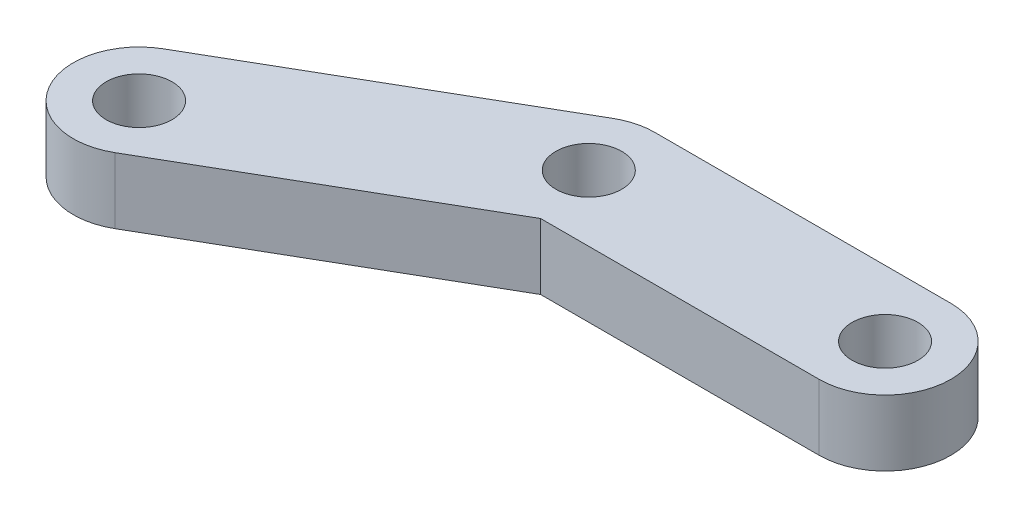
ISO-10303-21;
HEADER;
FILE_DESCRIPTION(('STEP AP214'),'2;1');
FILE_NAME('part.step','',(''),(''),'','','');
FILE_SCHEMA(('AUTOMOTIVE_DESIGN { 1 0 10303 214 1 1 1 1 }'));
ENDSEC;
DATA;
#1=APPLICATION_CONTEXT('core data for automotive mechanical design processes');
#2=APPLICATION_PROTOCOL_DEFINITION('international standard','automotive_design',2000,#1);
#3=PRODUCT_CONTEXT('',#1,'mechanical');
#4=PRODUCT('Part','Part','',(#3));
#5=PRODUCT_RELATED_PRODUCT_CATEGORY('part','',(#4));
#6=PRODUCT_DEFINITION_FORMATION('','',#4);
#7=PRODUCT_DEFINITION_CONTEXT('part definition',#1,'design');
#8=PRODUCT_DEFINITION('design','',#6,#7);
#9=PRODUCT_DEFINITION_SHAPE('','',#8);
#10=(LENGTH_UNIT() NAMED_UNIT(*) SI_UNIT(.MILLI.,.METRE.));
#11=(NAMED_UNIT(*) PLANE_ANGLE_UNIT() SI_UNIT($,.RADIAN.));
#12=(NAMED_UNIT(*) SI_UNIT($,.STERADIAN.) SOLID_ANGLE_UNIT());
#13=UNCERTAINTY_MEASURE_WITH_UNIT(LENGTH_MEASURE(1.E-05),#10,'distance_accuracy_value','');
#14=(GEOMETRIC_REPRESENTATION_CONTEXT(3) GLOBAL_UNCERTAINTY_ASSIGNED_CONTEXT((#13)) GLOBAL_UNIT_ASSIGNED_CONTEXT((#10,
#11,#12)) REPRESENTATION_CONTEXT('',''));
#15=CARTESIAN_POINT('',(0.,0.,0.));
#16=DIRECTION('',(0.,0.,1.));
#17=DIRECTION('',(1.,0.,0.));
#18=AXIS2_PLACEMENT_3D('',#15,#16,#17);
#19=CARTESIAN_POINT('',(0.,5.,0.));
#20=DIRECTION('',(0.,-1.,0.));
#21=DIRECTION('',(0.,0.,-1.));
#22=AXIS2_PLACEMENT_3D('',#19,#20,#21);
#23=CYLINDRICAL_SURFACE('',#22,5.);
#24=DIRECTION('',(0.,1.,0.));
#25=VECTOR('',#24,1.);
#26=CARTESIAN_POINT('',(-2.49999999999998,0.,-4.33012701892221));
#27=LINE('',#26,#25);
#28=CARTESIAN_POINT('',(-2.49999999999998,0.,-4.33012701892221));
#29=VERTEX_POINT('',#28);
#30=CARTESIAN_POINT('',(-2.49999999999998,5.,-4.33012701892221));
#31=VERTEX_POINT('',#30);
#32=EDGE_CURVE('E100',#29,#31,#27,.T.);
#33=ORIENTED_EDGE('',*,*,#32,.T.);
#34=CARTESIAN_POINT('',(0.,5.,0.));
#35=DIRECTION('',(0.,1.,0.));
#36=DIRECTION('',(0.,0.,1.));
#37=AXIS2_PLACEMENT_3D('',#34,#35,#36);
#38=CIRCLE('',#37,5.);
#39=CARTESIAN_POINT('',(0.,5.,-5.));
#40=VERTEX_POINT('',#39);
#41=EDGE_CURVE('E137',#40,#31,#38,.T.);
#42=ORIENTED_EDGE('',*,*,#41,.F.);
#43=DIRECTION('',(0.,-1.,0.));
#44=VECTOR('',#43,1.);
#45=CARTESIAN_POINT('',(0.,5.,-5.));
#46=LINE('',#45,#44);
#47=CARTESIAN_POINT('',(0.,0.,-5.));
#48=VERTEX_POINT('',#47);
#49=EDGE_CURVE('E123',#40,#48,#46,.T.);
#50=ORIENTED_EDGE('',*,*,#49,.T.);
#51=CARTESIAN_POINT('',(0.,0.,0.));
#52=DIRECTION('',(0.,1.,0.));
#53=DIRECTION('',(0.,0.,1.));
#54=AXIS2_PLACEMENT_3D('',#51,#52,#53);
#55=CIRCLE('',#54,5.);
#56=EDGE_CURVE('E118',#48,#29,#55,.T.);
#57=ORIENTED_EDGE('',*,*,#56,.T.);
#58=EDGE_LOOP('',(#33,#42,#50,#57));
#59=FACE_BOUND('',#58,.T.);
#60=ADVANCED_FACE('F35',(#59),#23,.T.);
#61=CARTESIAN_POINT('',(0.,5.,5.));
#62=DIRECTION('',(0.,0.,-1.));
#63=DIRECTION('',(-1.,0.,0.));
#64=AXIS2_PLACEMENT_3D('',#61,#62,#63);
#65=PLANE('',#64);
#66=DIRECTION('',(0.,1.,0.));
#67=VECTOR('',#66,1.);
#68=CARTESIAN_POINT('',(1.3397459621556,5.,5.));
#69=LINE('',#68,#67);
#70=CARTESIAN_POINT('',(1.3397459621556,0.,5.));
#71=VERTEX_POINT('',#70);
#72=CARTESIAN_POINT('',(1.3397459621556,5.,5.));
#73=VERTEX_POINT('',#72);
#74=EDGE_CURVE('E11',#71,#73,#69,.T.);
#75=ORIENTED_EDGE('',*,*,#74,.F.);
#76=DIRECTION('',(1.,0.,0.));
#77=VECTOR('',#76,1.);
#78=CARTESIAN_POINT('',(0.,0.,5.));
#79=LINE('',#78,#77);
#80=CARTESIAN_POINT('',(22.5,0.,5.));
#81=VERTEX_POINT('',#80);
#82=EDGE_CURVE('E124',#71,#81,#79,.T.);
#83=ORIENTED_EDGE('',*,*,#82,.T.);
#84=DIRECTION('',(0.,-1.,0.));
#85=VECTOR('',#84,1.);
#86=CARTESIAN_POINT('',(22.5,5.,5.));
#87=LINE('',#86,#85);
#88=CARTESIAN_POINT('',(22.5,5.,5.));
#89=VERTEX_POINT('',#88);
#90=EDGE_CURVE('E42',#89,#81,#87,.T.);
#91=ORIENTED_EDGE('',*,*,#90,.F.);
#92=DIRECTION('',(1.,0.,0.));
#93=VECTOR('',#92,1.);
#94=CARTESIAN_POINT('',(0.,5.,5.));
#95=LINE('',#94,#93);
#96=EDGE_CURVE('E76',#73,#89,#95,.T.);
#97=ORIENTED_EDGE('',*,*,#96,.F.);
#98=EDGE_LOOP('',(#75,#83,#91,#97));
#99=FACE_BOUND('',#98,.T.);
#100=ADVANCED_FACE('F150',(#99),#65,.F.);
#101=CARTESIAN_POINT('',(0.,5.,0.));
#102=DIRECTION('',(0.,1.,0.));
#103=DIRECTION('',(0.,0.,1.));
#104=AXIS2_PLACEMENT_3D('',#101,#102,#103);
#105=PLANE('',#104);
#106=DIRECTION('',(-0.866025403784442,0.,0.499999999999995));
#107=VECTOR('',#106,1.);
#108=CARTESIAN_POINT('',(2.49999999999997,5.,4.33012701892221));
#109=LINE('',#108,#107);
#110=CARTESIAN_POINT('',(-19.1506350946111,5.,16.8301270189221));
#111=VERTEX_POINT('',#110);
#112=EDGE_CURVE('E49',#73,#111,#109,.T.);
#113=ORIENTED_EDGE('',*,*,#112,.F.);
#114=ORIENTED_EDGE('',*,*,#96,.T.);
#115=CARTESIAN_POINT('',(22.5,5.,0.));
#116=DIRECTION('',(0.,1.,0.));
#117=DIRECTION('',(0.,0.,1.));
#118=AXIS2_PLACEMENT_3D('',#115,#116,#117);
#119=CIRCLE('',#118,5.);
#120=CARTESIAN_POINT('',(22.5,5.,-5.));
#121=VERTEX_POINT('',#120);
#122=EDGE_CURVE('E146',#89,#121,#119,.T.);
#123=ORIENTED_EDGE('',*,*,#122,.T.);
#124=DIRECTION('',(-1.,0.,0.));
#125=VECTOR('',#124,1.);
#126=CARTESIAN_POINT('',(0.,5.,-5.));
#127=LINE('',#126,#125);
#128=EDGE_CURVE('E56',#121,#40,#127,.T.);
#129=ORIENTED_EDGE('',*,*,#128,.T.);
#130=ORIENTED_EDGE('',*,*,#41,.T.);
#131=DIRECTION('',(-0.866025403784442,0.,0.499999999999995));
#132=VECTOR('',#131,1.);
#133=CARTESIAN_POINT('',(-2.49999999999997,5.,-4.33012701892221));
#134=LINE('',#133,#132);
#135=CARTESIAN_POINT('',(-24.150635094611,5.,8.16987298107767));
#136=VERTEX_POINT('',#135);
#137=EDGE_CURVE('E106',#31,#136,#134,.T.);
#138=ORIENTED_EDGE('',*,*,#137,.T.);
#139=CARTESIAN_POINT('',(-21.650635094611,5.,12.4999999999999));
#140=DIRECTION('',(0.,1.,0.));
#141=DIRECTION('',(0.,0.,1.));
#142=AXIS2_PLACEMENT_3D('',#139,#140,#141);
#143=CIRCLE('',#142,5.);
#144=EDGE_CURVE('E158',#136,#111,#143,.T.);
#145=ORIENTED_EDGE('',*,*,#144,.T.);
#146=EDGE_LOOP('',(#113,#114,#123,#129,#130,#138,#145));
#147=FACE_BOUND('',#146,.T.);
#148=CARTESIAN_POINT('',(0.,5.,0.));
#149=DIRECTION('',(0.,1.,0.));
#150=DIRECTION('',(0.,0.,1.));
#151=AXIS2_PLACEMENT_3D('',#148,#149,#150);
#152=CIRCLE('',#151,2.5);
#153=CARTESIAN_POINT('',(0.,5.,2.5));
#154=VERTEX_POINT('',#153);
#155=EDGE_CURVE('E125',#154,#154,#152,.T.);
#156=ORIENTED_EDGE('',*,*,#155,.F.);
#157=EDGE_LOOP('',(#156));
#158=FACE_BOUND('',#157,.T.);
#159=CARTESIAN_POINT('',(-21.650635094611,5.,12.4999999999999));
#160=DIRECTION('',(0.,1.,0.));
#161=DIRECTION('',(0.,0.,1.));
#162=AXIS2_PLACEMENT_3D('',#159,#160,#161);
#163=CIRCLE('',#162,2.5);
#164=CARTESIAN_POINT('',(-21.650635094611,5.,14.9999999999999));
#165=VERTEX_POINT('',#164);
#166=EDGE_CURVE('E155',#165,#165,#163,.T.);
#167=ORIENTED_EDGE('',*,*,#166,.F.);
#168=EDGE_LOOP('',(#167));
#169=FACE_BOUND('',#168,.T.);
#170=CARTESIAN_POINT('',(22.5,5.,0.));
#171=DIRECTION('',(0.,1.,0.));
#172=DIRECTION('',(0.,0.,1.));
#173=AXIS2_PLACEMENT_3D('',#170,#171,#172);
#174=CIRCLE('',#173,2.5);
#175=CARTESIAN_POINT('',(22.5,5.,2.5));
#176=VERTEX_POINT('',#175);
#177=EDGE_CURVE('E170',#176,#176,#174,.T.);
#178=ORIENTED_EDGE('',*,*,#177,.F.);
#179=EDGE_LOOP('',(#178));
#180=FACE_BOUND('',#179,.T.);
#181=ADVANCED_FACE('F178',(#147,#158,#169,#180),#105,.T.);
#182=CARTESIAN_POINT('',(0.,0.,0.));
#183=DIRECTION('',(0.,1.,0.));
#184=DIRECTION('',(0.,0.,1.));
#185=AXIS2_PLACEMENT_3D('',#182,#183,#184);
#186=PLANE('',#185);
#187=ORIENTED_EDGE('',*,*,#82,.F.);
#188=DIRECTION('',(-0.866025403784442,0.,0.499999999999995));
#189=VECTOR('',#188,1.);
#190=CARTESIAN_POINT('',(2.49999999999997,0.,4.33012701892221));
#191=LINE('',#190,#189);
#192=CARTESIAN_POINT('',(-19.1506350946111,0.,16.8301270189221));
#193=VERTEX_POINT('',#192);
#194=EDGE_CURVE('E121',#71,#193,#191,.T.);
#195=ORIENTED_EDGE('',*,*,#194,.T.);
#196=CARTESIAN_POINT('',(-21.650635094611,0.,12.4999999999999));
#197=DIRECTION('',(0.,1.,0.));
#198=DIRECTION('',(0.,0.,1.));
#199=AXIS2_PLACEMENT_3D('',#196,#197,#198);
#200=CIRCLE('',#199,5.);
#201=CARTESIAN_POINT('',(-24.150635094611,0.,8.16987298107767));
#202=VERTEX_POINT('',#201);
#203=EDGE_CURVE('E120',#202,#193,#200,.T.);
#204=ORIENTED_EDGE('',*,*,#203,.F.);
#205=DIRECTION('',(-0.866025403784442,0.,0.499999999999995));
#206=VECTOR('',#205,1.);
#207=CARTESIAN_POINT('',(-2.49999999999997,0.,-4.33012701892221));
#208=LINE('',#207,#206);
#209=EDGE_CURVE('E103',#29,#202,#208,.T.);
#210=ORIENTED_EDGE('',*,*,#209,.F.);
#211=ORIENTED_EDGE('',*,*,#56,.F.);
#212=DIRECTION('',(-1.,0.,0.));
#213=VECTOR('',#212,1.);
#214=CARTESIAN_POINT('',(0.,0.,-5.));
#215=LINE('',#214,#213);
#216=CARTESIAN_POINT('',(22.5,0.,-5.));
#217=VERTEX_POINT('',#216);
#218=EDGE_CURVE('E73',#217,#48,#215,.T.);
#219=ORIENTED_EDGE('',*,*,#218,.F.);
#220=CARTESIAN_POINT('',(22.5,0.,0.));
#221=DIRECTION('',(0.,1.,0.));
#222=DIRECTION('',(0.,0.,1.));
#223=AXIS2_PLACEMENT_3D('',#220,#221,#222);
#224=CIRCLE('',#223,5.);
#225=EDGE_CURVE('E127',#81,#217,#224,.T.);
#226=ORIENTED_EDGE('',*,*,#225,.F.);
#227=EDGE_LOOP('',(#187,#195,#204,#210,#211,#219,#226));
#228=FACE_BOUND('',#227,.T.);
#229=CARTESIAN_POINT('',(0.,0.,0.));
#230=DIRECTION('',(0.,1.,0.));
#231=DIRECTION('',(0.,0.,1.));
#232=AXIS2_PLACEMENT_3D('',#229,#230,#231);
#233=CIRCLE('',#232,2.5);
#234=CARTESIAN_POINT('',(0.,0.,2.5));
#235=VERTEX_POINT('',#234);
#236=EDGE_CURVE('E130',#235,#235,#233,.T.);
#237=ORIENTED_EDGE('',*,*,#236,.T.);
#238=EDGE_LOOP('',(#237));
#239=FACE_BOUND('',#238,.T.);
#240=CARTESIAN_POINT('',(-21.650635094611,0.,12.4999999999999));
#241=DIRECTION('',(0.,1.,0.));
#242=DIRECTION('',(0.,0.,1.));
#243=AXIS2_PLACEMENT_3D('',#240,#241,#242);
#244=CIRCLE('',#243,2.5);
#245=CARTESIAN_POINT('',(-21.650635094611,0.,14.9999999999999));
#246=VERTEX_POINT('',#245);
#247=EDGE_CURVE('E111',#246,#246,#244,.T.);
#248=ORIENTED_EDGE('',*,*,#247,.T.);
#249=EDGE_LOOP('',(#248));
#250=FACE_BOUND('',#249,.T.);
#251=CARTESIAN_POINT('',(22.5,0.,0.));
#252=DIRECTION('',(0.,1.,0.));
#253=DIRECTION('',(0.,0.,1.));
#254=AXIS2_PLACEMENT_3D('',#251,#252,#253);
#255=CIRCLE('',#254,2.5);
#256=CARTESIAN_POINT('',(22.5,0.,2.5));
#257=VERTEX_POINT('',#256);
#258=EDGE_CURVE('E168',#257,#257,#255,.T.);
#259=ORIENTED_EDGE('',*,*,#258,.T.);
#260=EDGE_LOOP('',(#259));
#261=FACE_BOUND('',#260,.T.);
#262=ADVANCED_FACE('F116',(#228,#239,#250,#261),#186,.F.);
#263=CARTESIAN_POINT('',(22.5,5.,0.));
#264=DIRECTION('',(0.,-1.,0.));
#265=DIRECTION('',(0.,0.,-1.));
#266=AXIS2_PLACEMENT_3D('',#263,#264,#265);
#267=CYLINDRICAL_SURFACE('',#266,5.);
#268=ORIENTED_EDGE('',*,*,#225,.T.);
#269=DIRECTION('',(0.,-1.,0.));
#270=VECTOR('',#269,1.);
#271=CARTESIAN_POINT('',(22.5,5.,-5.));
#272=LINE('',#271,#270);
#273=EDGE_CURVE('E139',#121,#217,#272,.T.);
#274=ORIENTED_EDGE('',*,*,#273,.F.);
#275=ORIENTED_EDGE('',*,*,#122,.F.);
#276=ORIENTED_EDGE('',*,*,#90,.T.);
#277=EDGE_LOOP('',(#268,#274,#275,#276));
#278=FACE_BOUND('',#277,.T.);
#279=ADVANCED_FACE('F144',(#278),#267,.T.);
#280=CARTESIAN_POINT('',(0.,5.,-5.));
#281=DIRECTION('',(0.,0.,1.));
#282=DIRECTION('',(1.,0.,0.));
#283=AXIS2_PLACEMENT_3D('',#280,#281,#282);
#284=PLANE('',#283);
#285=ORIENTED_EDGE('',*,*,#218,.T.);
#286=ORIENTED_EDGE('',*,*,#49,.F.);
#287=ORIENTED_EDGE('',*,*,#128,.F.);
#288=ORIENTED_EDGE('',*,*,#273,.T.);
#289=EDGE_LOOP('',(#285,#286,#287,#288));
#290=FACE_BOUND('',#289,.T.);
#291=ADVANCED_FACE('F180',(#290),#284,.F.);
#292=CARTESIAN_POINT('',(0.,5.,0.));
#293=DIRECTION('',(0.,-1.,0.));
#294=DIRECTION('',(0.,0.,-1.));
#295=AXIS2_PLACEMENT_3D('',#292,#293,#294);
#296=CYLINDRICAL_SURFACE('',#295,2.5);
#297=ORIENTED_EDGE('',*,*,#155,.T.);
#298=EDGE_LOOP('',(#297));
#299=FACE_BOUND('',#298,.T.);
#300=ORIENTED_EDGE('',*,*,#236,.F.);
#301=EDGE_LOOP('',(#300));
#302=FACE_BOUND('',#301,.T.);
#303=ADVANCED_FACE('F208',(#299,#302),#296,.F.);
#304=CARTESIAN_POINT('',(22.5,5.,0.));
#305=DIRECTION('',(0.,-1.,0.));
#306=DIRECTION('',(0.,0.,-1.));
#307=AXIS2_PLACEMENT_3D('',#304,#305,#306);
#308=CYLINDRICAL_SURFACE('',#307,2.5);
#309=ORIENTED_EDGE('',*,*,#177,.T.);
#310=EDGE_LOOP('',(#309));
#311=FACE_BOUND('',#310,.T.);
#312=ORIENTED_EDGE('',*,*,#258,.F.);
#313=EDGE_LOOP('',(#312));
#314=FACE_BOUND('',#313,.T.);
#315=ADVANCED_FACE('F192',(#311,#314),#308,.F.);
#316=CARTESIAN_POINT('',(2.49999999999997,0.,4.33012701892221));
#317=DIRECTION('',(-0.499999999999995,0.,-0.866025403784442));
#318=DIRECTION('',(-0.866025403784442,0.,0.499999999999995));
#319=AXIS2_PLACEMENT_3D('',#316,#317,#318);
#320=PLANE('',#319);
#321=ORIENTED_EDGE('',*,*,#194,.F.);
#322=ORIENTED_EDGE('',*,*,#74,.T.);
#323=ORIENTED_EDGE('',*,*,#112,.T.);
#324=DIRECTION('',(0.,1.,0.));
#325=VECTOR('',#324,1.);
#326=CARTESIAN_POINT('',(-19.1506350946111,0.,16.8301270189221));
#327=LINE('',#326,#325);
#328=EDGE_CURVE('E154',#193,#111,#327,.T.);
#329=ORIENTED_EDGE('',*,*,#328,.F.);
#330=EDGE_LOOP('',(#321,#322,#323,#329));
#331=FACE_BOUND('',#330,.T.);
#332=ADVANCED_FACE('F152',(#331),#320,.F.);
#333=CARTESIAN_POINT('',(-21.650635094611,0.,12.4999999999999));
#334=DIRECTION('',(0.,1.,0.));
#335=DIRECTION('',(0.,0.,1.));
#336=AXIS2_PLACEMENT_3D('',#333,#334,#335);
#337=CYLINDRICAL_SURFACE('',#336,5.);
#338=ORIENTED_EDGE('',*,*,#144,.F.);
#339=DIRECTION('',(0.,1.,0.));
#340=VECTOR('',#339,1.);
#341=CARTESIAN_POINT('',(-24.150635094611,0.,8.16987298107767));
#342=LINE('',#341,#340);
#343=EDGE_CURVE('E110',#202,#136,#342,.T.);
#344=ORIENTED_EDGE('',*,*,#343,.F.);
#345=ORIENTED_EDGE('',*,*,#203,.T.);
#346=ORIENTED_EDGE('',*,*,#328,.T.);
#347=EDGE_LOOP('',(#338,#344,#345,#346));
#348=FACE_BOUND('',#347,.T.);
#349=ADVANCED_FACE('F183',(#348),#337,.T.);
#350=CARTESIAN_POINT('',(-2.49999999999997,0.,-4.33012701892221));
#351=DIRECTION('',(-0.499999999999995,0.,-0.866025403784442));
#352=DIRECTION('',(-0.866025403784442,0.,0.499999999999995));
#353=AXIS2_PLACEMENT_3D('',#350,#351,#352);
#354=PLANE('',#353);
#355=ORIENTED_EDGE('',*,*,#137,.F.);
#356=ORIENTED_EDGE('',*,*,#32,.F.);
#357=ORIENTED_EDGE('',*,*,#209,.T.);
#358=ORIENTED_EDGE('',*,*,#343,.T.);
#359=EDGE_LOOP('',(#355,#356,#357,#358));
#360=FACE_BOUND('',#359,.T.);
#361=ADVANCED_FACE('F102',(#360),#354,.T.);
#362=CARTESIAN_POINT('',(-21.650635094611,0.,12.4999999999999));
#363=DIRECTION('',(0.,1.,0.));
#364=DIRECTION('',(0.,0.,1.));
#365=AXIS2_PLACEMENT_3D('',#362,#363,#364);
#366=CYLINDRICAL_SURFACE('',#365,2.5);
#367=ORIENTED_EDGE('',*,*,#247,.F.);
#368=EDGE_LOOP('',(#367));
#369=FACE_BOUND('',#368,.T.);
#370=ORIENTED_EDGE('',*,*,#166,.T.);
#371=EDGE_LOOP('',(#370));
#372=FACE_BOUND('',#371,.T.);
#373=ADVANCED_FACE('F190',(#369,#372),#366,.F.);
#374=CLOSED_SHELL('',(#60,#100,#181,#262,#279,#291,#303,#315,#332,#349,#361,#373));
#375=MANIFOLD_SOLID_BREP('B2',#374);
#376=ADVANCED_BREP_SHAPE_REPRESENTATION('',(#18,#375),#14);
#377=SHAPE_DEFINITION_REPRESENTATION(#9,#376);
ENDSEC;
END-ISO-10303-21;
